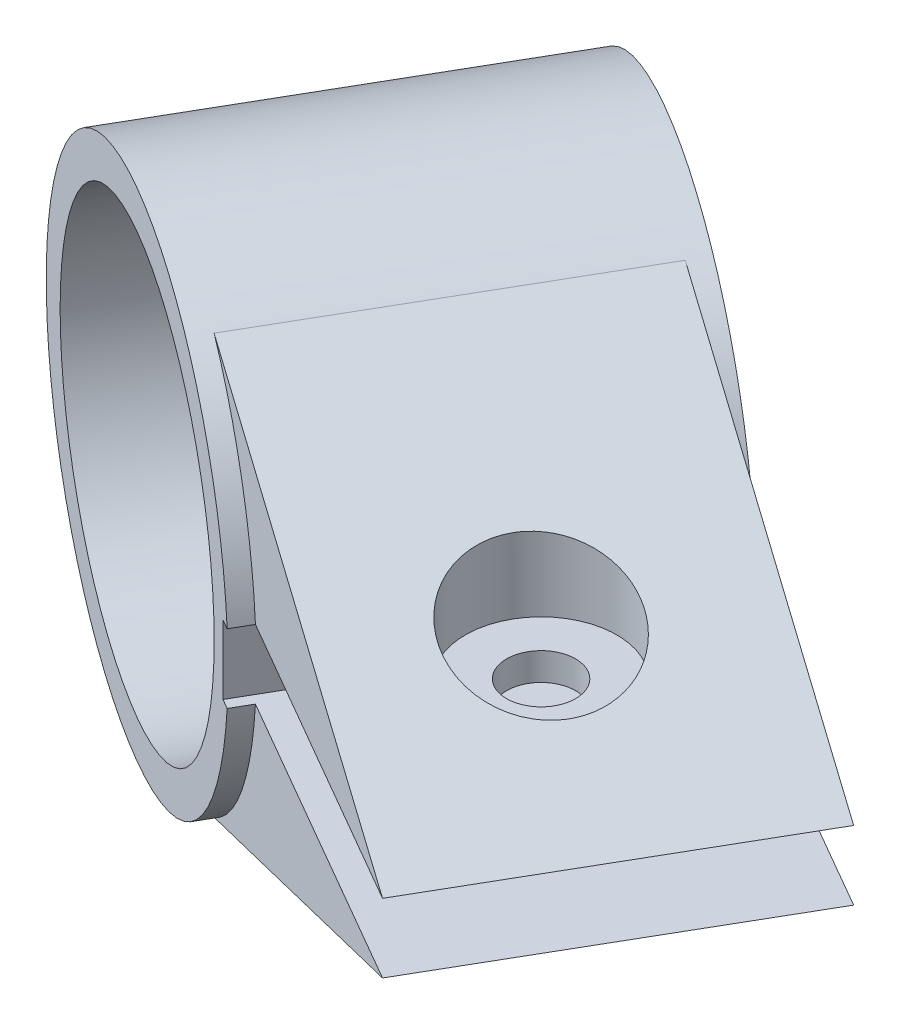
ISO-10303-21;
HEADER;
FILE_DESCRIPTION(('STEP AP214'),'2;1');
FILE_NAME('part.step','',(''),(''),'','','');
FILE_SCHEMA(('AUTOMOTIVE_DESIGN { 1 0 10303 214 1 1 1 1 }'));
ENDSEC;
DATA;
#1=APPLICATION_CONTEXT('core data for automotive mechanical design processes');
#2=APPLICATION_PROTOCOL_DEFINITION('international standard','automotive_design',2000,#1);
#3=PRODUCT_CONTEXT('',#1,'mechanical');
#4=PRODUCT('Part','Part','',(#3));
#5=PRODUCT_RELATED_PRODUCT_CATEGORY('part','',(#4));
#6=PRODUCT_DEFINITION_FORMATION('','',#4);
#7=PRODUCT_DEFINITION_CONTEXT('part definition',#1,'design');
#8=PRODUCT_DEFINITION('design','',#6,#7);
#9=PRODUCT_DEFINITION_SHAPE('','',#8);
#10=(LENGTH_UNIT() NAMED_UNIT(*) SI_UNIT(.MILLI.,.METRE.));
#11=(NAMED_UNIT(*) PLANE_ANGLE_UNIT() SI_UNIT($,.RADIAN.));
#12=(NAMED_UNIT(*) SI_UNIT($,.STERADIAN.) SOLID_ANGLE_UNIT());
#13=UNCERTAINTY_MEASURE_WITH_UNIT(LENGTH_MEASURE(1.E-05),#10,'distance_accuracy_value','');
#14=(GEOMETRIC_REPRESENTATION_CONTEXT(3) GLOBAL_UNCERTAINTY_ASSIGNED_CONTEXT((#13)) GLOBAL_UNIT_ASSIGNED_CONTEXT((#10,
#11,#12)) REPRESENTATION_CONTEXT('',''));
#15=CARTESIAN_POINT('',(0.,0.,0.));
#16=DIRECTION('',(0.,0.,1.));
#17=DIRECTION('',(1.,0.,0.));
#18=AXIS2_PLACEMENT_3D('',#15,#16,#17);
#19=CARTESIAN_POINT('',(-32.9089653438091,5.,-46.9999999999997));
#20=DIRECTION('',(-0.866025403784443,0.,-0.499999999999993));
#21=DIRECTION('',(-0.499999999999993,0.,0.866025403784443));
#22=AXIS2_PLACEMENT_3D('',#19,#20,#21);
#23=PLANE('',#22);
#24=DIRECTION('',(0.,1.,0.));
#25=VECTOR('',#24,1.);
#26=CARTESIAN_POINT('',(-38.0333209967911,2.4999999999999,-38.1243556529818));
#27=LINE('',#26,#25);
#28=CARTESIAN_POINT('',(-38.0333209967911,0.,-38.1243556529818));
#29=VERTEX_POINT('',#28);
#30=CARTESIAN_POINT('',(-38.0333209967911,5.,-38.1243556529818));
#31=VERTEX_POINT('',#30);
#32=EDGE_CURVE('E49',#29,#31,#27,.T.);
#33=ORIENTED_EDGE('',*,*,#32,.T.);
#34=DIRECTION('',(-0.499999999999993,0.,0.866025403784443));
#35=VECTOR('',#34,1.);
#36=CARTESIAN_POINT('',(-28.5788383248869,5.,-54.4999999999998));
#37=LINE('',#36,#35);
#38=CARTESIAN_POINT('',(-52.0333209967909,5.,-13.8756443470174));
#39=VERTEX_POINT('',#38);
#40=EDGE_CURVE('E151',#31,#39,#37,.T.);
#41=ORIENTED_EDGE('',*,*,#40,.T.);
#42=DIRECTION('',(0.,1.,0.));
#43=VECTOR('',#42,1.);
#44=CARTESIAN_POINT('',(-52.0333209967909,2.49999999999974,-13.8756443470174));
#45=LINE('',#44,#43);
#46=CARTESIAN_POINT('',(-52.0333209967909,0.,-13.8756443470174));
#47=VERTEX_POINT('',#46);
#48=EDGE_CURVE('E212',#47,#39,#45,.T.);
#49=ORIENTED_EDGE('',*,*,#48,.F.);
#50=DIRECTION('',(0.499999999999993,0.,-0.866025403784443));
#51=VECTOR('',#50,1.);
#52=CARTESIAN_POINT('',(-32.9089653438091,0.,-46.9999999999997));
#53=LINE('',#52,#51);
#54=EDGE_CURVE('E139',#47,#29,#53,.T.);
#55=ORIENTED_EDGE('',*,*,#54,.T.);
#56=EDGE_LOOP('',(#33,#41,#49,#55));
#57=FACE_BOUND('',#56,.T.);
#58=ADVANCED_FACE('F45',(#57),#23,.F.);
#59=CARTESIAN_POINT('',(-52.7557528611267,2.4999999999999,-46.6243556529817));
#60=DIRECTION('',(0.499999999999993,0.,-0.866025403784443));
#61=DIRECTION('',(-0.866025403784443,0.,-0.499999999999993));
#62=AXIS2_PLACEMENT_3D('',#59,#60,#61);
#63=PLANE('',#62);
#64=ORIENTED_EDGE('',*,*,#32,.F.);
#65=DIRECTION('',(-0.866025403784443,0.,-0.499999999999993));
#66=VECTOR('',#65,1.);
#67=CARTESIAN_POINT('',(-52.7557528611267,0.,-46.6243556529817));
#68=LINE('',#67,#66);
#69=CARTESIAN_POINT('',(-37.3183793798636,0.,-37.7115839179939));
#70=VERTEX_POINT('',#69);
#71=EDGE_CURVE('E181',#70,#29,#68,.T.);
#72=ORIENTED_EDGE('',*,*,#71,.F.);
#73=CARTESIAN_POINT('',(-52.7557528611267,2.4999999999999,-46.6243556529817));
#74=DIRECTION('',(0.499999999999993,0.,-0.866025403784443));
#75=DIRECTION('',(-0.866025403784443,0.,-0.499999999999993));
#76=AXIS2_PLACEMENT_3D('',#73,#74,#75);
#77=CIRCLE('',#76,18.);
#78=CARTESIAN_POINT('',(-37.3183793798637,5.,-37.7115839179939));
#79=VERTEX_POINT('',#78);
#80=EDGE_CURVE('E215',#70,#79,#77,.T.);
#81=ORIENTED_EDGE('',*,*,#80,.T.);
#82=DIRECTION('',(-0.866025403784443,0.,-0.499999999999993));
#83=VECTOR('',#82,1.);
#84=CARTESIAN_POINT('',(6.99999999999989,5.,-12.1243556529822));
#85=LINE('',#84,#83);
#86=EDGE_CURVE('E144',#79,#31,#85,.T.);
#87=ORIENTED_EDGE('',*,*,#86,.T.);
#88=EDGE_LOOP('',(#64,#72,#81,#87));
#89=FACE_BOUND('',#88,.T.);
#90=CARTESIAN_POINT('',(-52.7557528611267,2.4999999999999,-46.6243556529817));
#91=DIRECTION('',(0.499999999999993,0.,-0.866025403784443));
#92=DIRECTION('',(-0.866025403784443,0.,-0.499999999999993));
#93=AXIS2_PLACEMENT_3D('',#90,#91,#92);
#94=CIRCLE('',#93,15.25);
#95=CARTESIAN_POINT('',(-65.9626402688394,2.49999999999996,-54.2493556529816));
#96=VERTEX_POINT('',#95);
#97=EDGE_CURVE('E221',#96,#96,#94,.T.);
#98=ORIENTED_EDGE('',*,*,#97,.F.);
#99=EDGE_LOOP('',(#98));
#100=FACE_BOUND('',#99,.T.);
#101=ADVANCED_FACE('F227',(#89,#100),#63,.T.);
#102=CARTESIAN_POINT('',(-66.7557528611265,2.49999999999974,-22.3756443470173));
#103=DIRECTION('',(0.499999999999993,0.,-0.866025403784443));
#104=DIRECTION('',(-0.866025403784443,0.,-0.499999999999993));
#105=AXIS2_PLACEMENT_3D('',#102,#103,#104);
#106=PLANE('',#105);
#107=DIRECTION('',(-0.866025403784443,0.,-0.499999999999993));
#108=VECTOR('',#107,1.);
#109=CARTESIAN_POINT('',(-66.7557528611265,0.,-22.3756443470173));
#110=LINE('',#109,#108);
#111=CARTESIAN_POINT('',(-51.3183793798634,-1.61762964134837E-13,-13.4628726120295));
#112=VERTEX_POINT('',#111);
#113=EDGE_CURVE('E200',#112,#47,#110,.T.);
#114=ORIENTED_EDGE('',*,*,#113,.T.);
#115=ORIENTED_EDGE('',*,*,#48,.T.);
#116=DIRECTION('',(-0.866025403784443,0.,-0.499999999999993));
#117=VECTOR('',#116,1.);
#118=CARTESIAN_POINT('',(-6.99999999999991,5.,12.1243556529822));
#119=LINE('',#118,#117);
#120=CARTESIAN_POINT('',(-51.3183793798635,4.99999999999984,-13.4628726120295));
#121=VERTEX_POINT('',#120);
#122=EDGE_CURVE('E62',#121,#39,#119,.T.);
#123=ORIENTED_EDGE('',*,*,#122,.F.);
#124=CARTESIAN_POINT('',(-66.7557528611265,2.49999999999974,-22.3756443470173));
#125=DIRECTION('',(0.499999999999993,0.,-0.866025403784443));
#126=DIRECTION('',(-0.866025403784443,0.,-0.499999999999993));
#127=AXIS2_PLACEMENT_3D('',#124,#125,#126);
#128=CIRCLE('',#127,18.);
#129=EDGE_CURVE('E224',#112,#121,#128,.T.);
#130=ORIENTED_EDGE('',*,*,#129,.F.);
#131=EDGE_LOOP('',(#114,#115,#123,#130));
#132=FACE_BOUND('',#131,.T.);
#133=CARTESIAN_POINT('',(-66.7557528611265,2.49999999999974,-22.3756443470173));
#134=DIRECTION('',(0.499999999999993,0.,-0.866025403784443));
#135=DIRECTION('',(-0.866025403784443,0.,-0.499999999999993));
#136=AXIS2_PLACEMENT_3D('',#133,#134,#135);
#137=CIRCLE('',#136,15.25);
#138=CARTESIAN_POINT('',(-79.9626402688392,2.49999999999979,-30.0006443470172));
#139=VERTEX_POINT('',#138);
#140=EDGE_CURVE('E132',#139,#139,#137,.T.);
#141=ORIENTED_EDGE('',*,*,#140,.T.);
#142=EDGE_LOOP('',(#141));
#143=FACE_BOUND('',#142,.T.);
#144=ADVANCED_FACE('F250',(#132,#143),#106,.F.);
#145=CARTESIAN_POINT('',(-52.7557528611267,2.4999999999999,-46.6243556529817));
#146=DIRECTION('',(-0.499999999999993,0.,0.866025403784443));
#147=DIRECTION('',(0.866025403784443,0.,0.499999999999993));
#148=AXIS2_PLACEMENT_3D('',#145,#146,#147);
#149=CYLINDRICAL_SURFACE('',#148,15.25);
#150=ORIENTED_EDGE('',*,*,#97,.T.);
#151=EDGE_LOOP('',(#150));
#152=FACE_BOUND('',#151,.T.);
#153=ORIENTED_EDGE('',*,*,#140,.F.);
#154=EDGE_LOOP('',(#153));
#155=FACE_BOUND('',#154,.T.);
#156=ADVANCED_FACE('F260',(#152,#155),#149,.F.);
#157=CARTESIAN_POINT('',(-51.4023611816306,17.6974053684145,-29.6771670651969));
#158=DIRECTION('',(0.308110113816307,0.934571672132285,0.177887457151892));
#159=DIRECTION('',(0.80936280972386,-0.355774914303783,0.467285836066144));
#160=AXIS2_PLACEMENT_3D('',#157,#158,#159);
#161=PLANE('',#160);
#162=DIRECTION('',(0.80936280972386,-0.355774914303783,0.467285836066144));
#163=VECTOR('',#162,1.);
#164=CARTESIAN_POINT('',(-57.6523611816307,17.6974053684145,-18.8518495178914));
#165=LINE('',#164,#163);
#166=CARTESIAN_POINT('',(-57.6523611816314,17.6974053684148,-18.8518495178918));
#167=VERTEX_POINT('',#166);
#168=CARTESIAN_POINT('',(-28.7666604983955,5.00000000000002,-2.17468245269459));
#169=VERTEX_POINT('',#168);
#170=EDGE_CURVE('E11',#167,#169,#165,.T.);
#171=ORIENTED_EDGE('',*,*,#170,.T.);
#172=DIRECTION('',(0.500000000000001,0.,-0.866025403784438));
#173=VECTOR('',#172,1.);
#174=CARTESIAN_POINT('',(-22.5166604983953,5.,-13.));
#175=LINE('',#174,#173);
#176=CARTESIAN_POINT('',(-16.2666604983953,5.,-23.8253175473055));
#177=VERTEX_POINT('',#176);
#178=EDGE_CURVE('E140',#169,#177,#175,.T.);
#179=ORIENTED_EDGE('',*,*,#178,.T.);
#180=DIRECTION('',(0.80936280972386,-0.355774914303783,0.467285836066144));
#181=VECTOR('',#180,1.);
#182=CARTESIAN_POINT('',(-45.1523611816306,17.6974053684145,-40.5024846125024));
#183=LINE('',#182,#181);
#184=CARTESIAN_POINT('',(-45.1523611816313,17.6974053684148,-40.5024846125028));
#185=VERTEX_POINT('',#184);
#186=EDGE_CURVE('E54',#185,#177,#183,.T.);
#187=ORIENTED_EDGE('',*,*,#186,.F.);
#188=DIRECTION('',(-0.499999999999993,0.,0.866025403784443));
#189=VECTOR('',#188,1.);
#190=CARTESIAN_POINT('',(-44.4023611816316,17.6974053684148,-41.8015227181789));
#191=LINE('',#190,#189);
#192=EDGE_CURVE('E129',#167,#185,#191,.F.);
#193=ORIENTED_EDGE('',*,*,#192,.F.);
#194=EDGE_LOOP('',(#171,#179,#187,#193));
#195=FACE_BOUND('',#194,.T.);
#196=CARTESIAN_POINT('',(-34.805904521194,10.3280101079492,-19.7063016147581));
#197=DIRECTION('',(0.308110113816307,0.934571672132285,0.177887457151892));
#198=DIRECTION('',(-0.80936280972386,0.355774914303783,-0.467285836066144));
#199=AXIS2_PLACEMENT_3D('',#196,#197,#198);
#200=ELLIPSE('',#199,5.88504890957308,5.5);
#201=CARTESIAN_POINT('',(-39.5690442420084,12.4217628794261,-22.4563016147581));
#202=VERTEX_POINT('',#201);
#203=EDGE_CURVE('E160',#202,#202,#200,.T.);
#204=ORIENTED_EDGE('',*,*,#203,.F.);
#205=EDGE_LOOP('',(#204));
#206=FACE_BOUND('',#205,.T.);
#207=ADVANCED_FACE('F257',(#195,#206),#161,.T.);
#208=CARTESIAN_POINT('',(-52.7557528611267,2.4999999999999,-46.6243556529817));
#209=DIRECTION('',(-0.499999999999993,0.,0.866025403784443));
#210=DIRECTION('',(0.866025403784443,0.,0.499999999999993));
#211=AXIS2_PLACEMENT_3D('',#208,#209,#210);
#212=CYLINDRICAL_SURFACE('',#211,18.);
#213=ORIENTED_EDGE('',*,*,#80,.F.);
#214=DIRECTION('',(-0.499999999999993,0.,0.866025403784443));
#215=VECTOR('',#214,1.);
#216=CARTESIAN_POINT('',(-37.3183793798636,0.,-37.7115839179939));
#217=LINE('',#216,#215);
#218=CARTESIAN_POINT('',(-38.0683793798634,0.,-36.4125458123176));
#219=VERTEX_POINT('',#218);
#220=EDGE_CURVE('E185',#70,#219,#217,.T.);
#221=ORIENTED_EDGE('',*,*,#220,.T.);
#222=CARTESIAN_POINT('',(-53.5057528611263,2.4999999999999,-45.3253175473056));
#223=DIRECTION('',(0.500000000000001,0.,-0.866025403784438));
#224=DIRECTION('',(-0.866025403784438,0.,-0.500000000000001));
#225=AXIS2_PLACEMENT_3D('',#222,#223,#224);
#226=CIRCLE('',#225,18.);
#227=CARTESIAN_POINT('',(-45.1523611816307,-12.6974053684145,-40.5024846125024));
#228=VERTEX_POINT('',#227);
#229=EDGE_CURVE('E199',#219,#228,#226,.T.);
#230=ORIENTED_EDGE('',*,*,#229,.T.);
#231=DIRECTION('',(-0.499999999999993,0.,0.866025403784443));
#232=VECTOR('',#231,1.);
#233=CARTESIAN_POINT('',(-44.402361181631,-12.6974053684145,-41.8015227181785));
#234=LINE('',#233,#232);
#235=CARTESIAN_POINT('',(-57.6523611816297,-12.697405368414,-18.8518495178909));
#236=VERTEX_POINT('',#235);
#237=EDGE_CURVE('E196',#228,#236,#234,.T.);
#238=ORIENTED_EDGE('',*,*,#237,.T.);
#239=CARTESIAN_POINT('',(-66.0057528611262,2.49999999999975,-23.6746824526945));
#240=DIRECTION('',(0.500000000000001,0.,-0.866025403784438));
#241=DIRECTION('',(-0.866025403784438,0.,-0.500000000000001));
#242=AXIS2_PLACEMENT_3D('',#239,#240,#241);
#243=CIRCLE('',#242,18.);
#244=CARTESIAN_POINT('',(-50.5683793798632,-1.53089346754953E-13,-14.7619107177066));
#245=VERTEX_POINT('',#244);
#246=EDGE_CURVE('E205',#245,#236,#243,.T.);
#247=ORIENTED_EDGE('',*,*,#246,.F.);
#248=EDGE_CURVE('E184',#245,#112,#217,.T.);
#249=ORIENTED_EDGE('',*,*,#248,.T.);
#250=ORIENTED_EDGE('',*,*,#129,.T.);
#251=DIRECTION('',(-0.499999999999993,0.,0.866025403784443));
#252=VECTOR('',#251,1.);
#253=CARTESIAN_POINT('',(-37.3183793798637,5.,-37.7115839179939));
#254=LINE('',#253,#252);
#255=CARTESIAN_POINT('',(-50.5683793798632,4.99999999999985,-14.7619107177066));
#256=VERTEX_POINT('',#255);
#257=EDGE_CURVE('E147',#256,#121,#254,.T.);
#258=ORIENTED_EDGE('',*,*,#257,.F.);
#259=CARTESIAN_POINT('',(-66.0057528611262,2.49999999999975,-23.6746824526945));
#260=DIRECTION('',(0.500000000000001,0.,-0.866025403784438));
#261=DIRECTION('',(-0.866025403784438,0.,-0.500000000000001));
#262=AXIS2_PLACEMENT_3D('',#259,#260,#261);
#263=CIRCLE('',#262,18.);
#264=EDGE_CURVE('E70',#167,#256,#263,.T.);
#265=ORIENTED_EDGE('',*,*,#264,.F.);
#266=ORIENTED_EDGE('',*,*,#192,.T.);
#267=CARTESIAN_POINT('',(-53.5057528611263,2.4999999999999,-45.3253175473056));
#268=DIRECTION('',(0.500000000000001,0.,-0.866025403784438));
#269=DIRECTION('',(-0.866025403784438,0.,-0.500000000000001));
#270=AXIS2_PLACEMENT_3D('',#267,#268,#269);
#271=CIRCLE('',#270,18.);
#272=CARTESIAN_POINT('',(-38.0683793798634,4.99999999999999,-36.4125458123177));
#273=VERTEX_POINT('',#272);
#274=EDGE_CURVE('E124',#185,#273,#271,.T.);
#275=ORIENTED_EDGE('',*,*,#274,.T.);
#276=EDGE_CURVE('E127',#79,#273,#254,.T.);
#277=ORIENTED_EDGE('',*,*,#276,.F.);
#278=EDGE_LOOP('',(#213,#221,#230,#238,#247,#249,#250,#258,#265,#266,#275,#277));
#279=FACE_BOUND('',#278,.T.);
#280=ADVANCED_FACE('F47',(#279),#212,.T.);
#281=CARTESIAN_POINT('',(0.543026266155381,2.49999999999987,14.7472730906825));
#282=DIRECTION('',(0.500000000000001,0.,-0.866025403784438));
#283=DIRECTION('',(-0.866025403784438,0.,-0.500000000000001));
#284=AXIS2_PLACEMENT_3D('',#281,#282,#283);
#285=PLANE('',#284);
#286=ORIENTED_EDGE('',*,*,#264,.T.);
#287=DIRECTION('',(-0.866025403784438,0.,-0.500000000000001));
#288=VECTOR('',#287,1.);
#289=CARTESIAN_POINT('',(-6.25000000000001,5.,10.8253175473055));
#290=LINE('',#289,#288);
#291=EDGE_CURVE('E145',#169,#256,#290,.T.);
#292=ORIENTED_EDGE('',*,*,#291,.F.);
#293=ORIENTED_EDGE('',*,*,#170,.F.);
#294=EDGE_LOOP('',(#286,#292,#293));
#295=FACE_BOUND('',#294,.T.);
#296=ADVANCED_FACE('F255',(#295),#285,.F.);
#297=CARTESIAN_POINT('',(13.0430262661554,2.49999999999987,-6.90336200392846));
#298=DIRECTION('',(0.500000000000001,0.,-0.866025403784438));
#299=DIRECTION('',(-0.866025403784438,0.,-0.500000000000001));
#300=AXIS2_PLACEMENT_3D('',#297,#298,#299);
#301=PLANE('',#300);
#302=ORIENTED_EDGE('',*,*,#186,.T.);
#303=DIRECTION('',(-0.866025403784438,0.,-0.500000000000001));
#304=VECTOR('',#303,1.);
#305=CARTESIAN_POINT('',(6.25000000000002,5.,-10.8253175473055));
#306=LINE('',#305,#304);
#307=EDGE_CURVE('E135',#177,#273,#306,.T.);
#308=ORIENTED_EDGE('',*,*,#307,.T.);
#309=ORIENTED_EDGE('',*,*,#274,.F.);
#310=EDGE_LOOP('',(#302,#308,#309));
#311=FACE_BOUND('',#310,.T.);
#312=ADVANCED_FACE('F136',(#311),#301,.T.);
#313=CARTESIAN_POINT('',(-32.9089653438091,0.,-46.9999999999997));
#314=DIRECTION('',(0.,-1.,0.));
#315=DIRECTION('',(0.,0.,-1.));
#316=AXIS2_PLACEMENT_3D('',#313,#314,#315);
#317=PLANE('',#316);
#318=CARTESIAN_POINT('',(-34.805904521194,0.,-19.7063016147581));
#319=DIRECTION('',(0.,-1.,0.));
#320=DIRECTION('',(0.,0.,-1.));
#321=AXIS2_PLACEMENT_3D('',#318,#319,#320);
#322=CIRCLE('',#321,2.5);
#323=CARTESIAN_POINT('',(-34.805904521194,0.,-22.2063016147581));
#324=VERTEX_POINT('',#323);
#325=EDGE_CURVE('E188',#324,#324,#322,.F.);
#326=ORIENTED_EDGE('',*,*,#325,.F.);
#327=EDGE_LOOP('',(#326));
#328=FACE_BOUND('',#327,.T.);
#329=ORIENTED_EDGE('',*,*,#54,.F.);
#330=ORIENTED_EDGE('',*,*,#113,.F.);
#331=ORIENTED_EDGE('',*,*,#248,.F.);
#332=DIRECTION('',(-0.866025403784438,0.,-0.500000000000001));
#333=VECTOR('',#332,1.);
#334=CARTESIAN_POINT('',(-6.25000000000001,0.,10.8253175473055));
#335=LINE('',#334,#333);
#336=CARTESIAN_POINT('',(-28.7666604983955,0.,-2.17468245269459));
#337=VERTEX_POINT('',#336);
#338=EDGE_CURVE('E175',#337,#245,#335,.T.);
#339=ORIENTED_EDGE('',*,*,#338,.F.);
#340=DIRECTION('',(-0.500000000000001,0.,0.866025403784438));
#341=VECTOR('',#340,1.);
#342=CARTESIAN_POINT('',(-22.5166604983953,0.,-13.));
#343=LINE('',#342,#341);
#344=CARTESIAN_POINT('',(-16.2666604983953,0.,-23.8253175473055));
#345=VERTEX_POINT('',#344);
#346=EDGE_CURVE('E191',#337,#345,#343,.F.);
#347=ORIENTED_EDGE('',*,*,#346,.T.);
#348=DIRECTION('',(-0.866025403784438,0.,-0.500000000000001));
#349=VECTOR('',#348,1.);
#350=CARTESIAN_POINT('',(6.25000000000002,0.,-10.8253175473055));
#351=LINE('',#350,#349);
#352=EDGE_CURVE('E170',#345,#219,#351,.T.);
#353=ORIENTED_EDGE('',*,*,#352,.T.);
#354=ORIENTED_EDGE('',*,*,#220,.F.);
#355=ORIENTED_EDGE('',*,*,#71,.T.);
#356=EDGE_LOOP('',(#329,#330,#331,#339,#347,#353,#354,#355));
#357=FACE_BOUND('',#356,.T.);
#358=ADVANCED_FACE('F234',(#328,#357),#317,.F.);
#359=CARTESIAN_POINT('',(-51.4023611816306,-12.6974053684145,-29.6771670651969));
#360=DIRECTION('',(-0.308110113816307,0.934571672132285,-0.177887457151892));
#361=DIRECTION('',(0.80936280972386,0.355774914303783,0.467285836066144));
#362=AXIS2_PLACEMENT_3D('',#359,#360,#361);
#363=PLANE('',#362);
#364=DIRECTION('',(0.80936280972386,0.355774914303783,0.467285836066144));
#365=VECTOR('',#364,1.);
#366=CARTESIAN_POINT('',(-45.1523611816306,-12.6974053684145,-40.5024846125024));
#367=LINE('',#366,#365);
#368=EDGE_CURVE('E203',#228,#345,#367,.T.);
#369=ORIENTED_EDGE('',*,*,#368,.T.);
#370=ORIENTED_EDGE('',*,*,#346,.F.);
#371=DIRECTION('',(0.80936280972386,0.355774914303783,0.467285836066144));
#372=VECTOR('',#371,1.);
#373=CARTESIAN_POINT('',(-57.6523611816307,-12.6974053684145,-18.8518495178914));
#374=LINE('',#373,#372);
#375=EDGE_CURVE('E201',#236,#337,#374,.T.);
#376=ORIENTED_EDGE('',*,*,#375,.F.);
#377=ORIENTED_EDGE('',*,*,#237,.F.);
#378=EDGE_LOOP('',(#369,#370,#376,#377));
#379=FACE_BOUND('',#378,.T.);
#380=CARTESIAN_POINT('',(-34.805904521194,-5.3280101079492,-19.7063016147581));
#381=DIRECTION('',(-0.308110113816307,0.934571672132285,-0.177887457151892));
#382=DIRECTION('',(-0.80936280972386,-0.355774914303783,-0.467285836066144));
#383=AXIS2_PLACEMENT_3D('',#380,#381,#382);
#384=ELLIPSE('',#383,5.88504890957308,5.5);
#385=CARTESIAN_POINT('',(-39.5690442420084,-7.42176287942613,-22.4563016147581));
#386=VERTEX_POINT('',#385);
#387=EDGE_CURVE('E174',#386,#386,#384,.T.);
#388=ORIENTED_EDGE('',*,*,#387,.T.);
#389=EDGE_LOOP('',(#388));
#390=FACE_BOUND('',#389,.T.);
#391=ADVANCED_FACE('F241',(#379,#390),#363,.F.);
#392=CARTESIAN_POINT('',(0.543026266155381,2.49999999999987,14.7472730906825));
#393=DIRECTION('',(0.500000000000001,0.,-0.866025403784438));
#394=DIRECTION('',(-0.866025403784438,0.,-0.500000000000001));
#395=AXIS2_PLACEMENT_3D('',#392,#393,#394);
#396=PLANE('',#395);
#397=ORIENTED_EDGE('',*,*,#375,.T.);
#398=ORIENTED_EDGE('',*,*,#338,.T.);
#399=ORIENTED_EDGE('',*,*,#246,.T.);
#400=EDGE_LOOP('',(#397,#398,#399));
#401=FACE_BOUND('',#400,.T.);
#402=ADVANCED_FACE('F247',(#401),#396,.F.);
#403=CARTESIAN_POINT('',(13.0430262661554,2.49999999999987,-6.90336200392846));
#404=DIRECTION('',(0.500000000000001,0.,-0.866025403784438));
#405=DIRECTION('',(-0.866025403784438,0.,-0.500000000000001));
#406=AXIS2_PLACEMENT_3D('',#403,#404,#405);
#407=PLANE('',#406);
#408=ORIENTED_EDGE('',*,*,#229,.F.);
#409=ORIENTED_EDGE('',*,*,#352,.F.);
#410=ORIENTED_EDGE('',*,*,#368,.F.);
#411=EDGE_LOOP('',(#408,#409,#410));
#412=FACE_BOUND('',#411,.T.);
#413=ADVANCED_FACE('F239',(#412),#407,.T.);
#414=CARTESIAN_POINT('',(-34.805904521194,-2.,-19.7063016147581));
#415=DIRECTION('',(0.,-1.,0.));
#416=DIRECTION('',(0.,0.,1.));
#417=AXIS2_PLACEMENT_3D('',#414,#415,#416);
#418=PLANE('',#417);
#419=CARTESIAN_POINT('',(-34.805904521194,-2.,-19.7063016147581));
#420=DIRECTION('',(0.,1.,0.));
#421=DIRECTION('',(0.,0.,1.));
#422=AXIS2_PLACEMENT_3D('',#419,#420,#421);
#423=CIRCLE('',#422,5.5);
#424=CARTESIAN_POINT('',(-34.805904521194,-2.,-14.2063016147581));
#425=VERTEX_POINT('',#424);
#426=EDGE_CURVE('E178',#425,#425,#423,.T.);
#427=ORIENTED_EDGE('',*,*,#426,.F.);
#428=EDGE_LOOP('',(#427));
#429=FACE_BOUND('',#428,.T.);
#430=CARTESIAN_POINT('',(-34.805904521194,-2.,-19.7063016147581));
#431=DIRECTION('',(0.,-1.,0.));
#432=DIRECTION('',(0.,0.,-1.));
#433=AXIS2_PLACEMENT_3D('',#430,#431,#432);
#434=CIRCLE('',#433,2.5);
#435=CARTESIAN_POINT('',(-34.805904521194,-2.,-22.2063016147581));
#436=VERTEX_POINT('',#435);
#437=EDGE_CURVE('E171',#436,#436,#434,.F.);
#438=ORIENTED_EDGE('',*,*,#437,.T.);
#439=EDGE_LOOP('',(#438));
#440=FACE_BOUND('',#439,.T.);
#441=ADVANCED_FACE('F307',(#429,#440),#418,.T.);
#442=CARTESIAN_POINT('',(-34.805904521194,-12.5,-19.7063016147581));
#443=DIRECTION('',(0.,1.,0.));
#444=DIRECTION('',(0.,0.,1.));
#445=AXIS2_PLACEMENT_3D('',#442,#443,#444);
#446=CYLINDRICAL_SURFACE('',#445,2.5);
#447=ORIENTED_EDGE('',*,*,#325,.T.);
#448=EDGE_LOOP('',(#447));
#449=FACE_BOUND('',#448,.T.);
#450=ORIENTED_EDGE('',*,*,#437,.F.);
#451=EDGE_LOOP('',(#450));
#452=FACE_BOUND('',#451,.T.);
#453=ADVANCED_FACE('F313',(#449,#452),#446,.F.);
#454=CARTESIAN_POINT('',(-34.805904521194,-2.,-19.7063016147581));
#455=DIRECTION('',(0.,-1.,0.));
#456=DIRECTION('',(0.,0.,-1.));
#457=AXIS2_PLACEMENT_3D('',#454,#455,#456);
#458=CYLINDRICAL_SURFACE('',#457,5.5);
#459=ORIENTED_EDGE('',*,*,#387,.F.);
#460=EDGE_LOOP('',(#459));
#461=FACE_BOUND('',#460,.T.);
#462=ORIENTED_EDGE('',*,*,#426,.T.);
#463=EDGE_LOOP('',(#462));
#464=FACE_BOUND('',#463,.T.);
#465=ADVANCED_FACE('F312',(#461,#464),#458,.F.);
#466=CARTESIAN_POINT('',(-24.2487113059647,5.,-51.9999999999998));
#467=DIRECTION('',(0.,1.,0.));
#468=DIRECTION('',(0.,0.,1.));
#469=AXIS2_PLACEMENT_3D('',#466,#467,#468);
#470=PLANE('',#469);
#471=ORIENTED_EDGE('',*,*,#40,.F.);
#472=ORIENTED_EDGE('',*,*,#86,.F.);
#473=ORIENTED_EDGE('',*,*,#276,.T.);
#474=ORIENTED_EDGE('',*,*,#307,.F.);
#475=ORIENTED_EDGE('',*,*,#178,.F.);
#476=ORIENTED_EDGE('',*,*,#291,.T.);
#477=ORIENTED_EDGE('',*,*,#257,.T.);
#478=ORIENTED_EDGE('',*,*,#122,.T.);
#479=EDGE_LOOP('',(#471,#472,#473,#474,#475,#476,#477,#478));
#480=FACE_BOUND('',#479,.T.);
#481=CARTESIAN_POINT('',(-34.805904521194,5.,-19.7063016147581));
#482=DIRECTION('',(0.,1.,0.));
#483=DIRECTION('',(0.,0.,1.));
#484=AXIS2_PLACEMENT_3D('',#481,#482,#483);
#485=CIRCLE('',#484,2.5);
#486=CARTESIAN_POINT('',(-34.805904521194,5.,-17.2063016147581));
#487=VERTEX_POINT('',#486);
#488=EDGE_CURVE('E155',#487,#487,#485,.F.);
#489=ORIENTED_EDGE('',*,*,#488,.F.);
#490=EDGE_LOOP('',(#489));
#491=FACE_BOUND('',#490,.T.);
#492=ADVANCED_FACE('F142',(#480,#491),#470,.F.);
#493=CARTESIAN_POINT('',(-34.805904521194,7.,-19.7063016147581));
#494=DIRECTION('',(0.,1.,0.));
#495=DIRECTION('',(0.,0.,1.));
#496=AXIS2_PLACEMENT_3D('',#493,#494,#495);
#497=PLANE('',#496);
#498=CARTESIAN_POINT('',(-34.805904521194,7.,-19.7063016147581));
#499=DIRECTION('',(0.,1.,0.));
#500=DIRECTION('',(0.,0.,1.));
#501=AXIS2_PLACEMENT_3D('',#498,#499,#500);
#502=CIRCLE('',#501,5.5);
#503=CARTESIAN_POINT('',(-34.805904521194,7.,-14.2063016147581));
#504=VERTEX_POINT('',#503);
#505=EDGE_CURVE('E152',#504,#504,#502,.T.);
#506=ORIENTED_EDGE('',*,*,#505,.T.);
#507=EDGE_LOOP('',(#506));
#508=FACE_BOUND('',#507,.T.);
#509=CARTESIAN_POINT('',(-34.805904521194,7.,-19.7063016147581));
#510=DIRECTION('',(0.,1.,0.));
#511=DIRECTION('',(0.,0.,1.));
#512=AXIS2_PLACEMENT_3D('',#509,#510,#511);
#513=CIRCLE('',#512,2.5);
#514=CARTESIAN_POINT('',(-34.805904521194,7.,-17.2063016147581));
#515=VERTEX_POINT('',#514);
#516=EDGE_CURVE('E158',#515,#515,#513,.F.);
#517=ORIENTED_EDGE('',*,*,#516,.T.);
#518=EDGE_LOOP('',(#517));
#519=FACE_BOUND('',#518,.T.);
#520=ADVANCED_FACE('F271',(#508,#519),#497,.T.);
#521=CARTESIAN_POINT('',(-34.805904521194,-12.5,-19.7063016147581));
#522=DIRECTION('',(0.,1.,0.));
#523=DIRECTION('',(0.,0.,1.));
#524=AXIS2_PLACEMENT_3D('',#521,#522,#523);
#525=CYLINDRICAL_SURFACE('',#524,2.5);
#526=ORIENTED_EDGE('',*,*,#488,.T.);
#527=EDGE_LOOP('',(#526));
#528=FACE_BOUND('',#527,.T.);
#529=ORIENTED_EDGE('',*,*,#516,.F.);
#530=EDGE_LOOP('',(#529));
#531=FACE_BOUND('',#530,.T.);
#532=ADVANCED_FACE('F267',(#528,#531),#525,.F.);
#533=CARTESIAN_POINT('',(-34.805904521194,7.,-19.7063016147581));
#534=DIRECTION('',(0.,1.,0.));
#535=DIRECTION('',(0.,0.,1.));
#536=AXIS2_PLACEMENT_3D('',#533,#534,#535);
#537=CYLINDRICAL_SURFACE('',#536,5.5);
#538=ORIENTED_EDGE('',*,*,#203,.T.);
#539=EDGE_LOOP('',(#538));
#540=FACE_BOUND('',#539,.T.);
#541=ORIENTED_EDGE('',*,*,#505,.F.);
#542=EDGE_LOOP('',(#541));
#543=FACE_BOUND('',#542,.T.);
#544=ADVANCED_FACE('F264',(#540,#543),#537,.F.);
#545=CLOSED_SHELL('',(#58,#101,#144,#156,#207,#280,#296,#312,#358,#391,#402,#413,#441,#453,#465,
#492,#520,#532,#544));
#546=MANIFOLD_SOLID_BREP('B2',#545);
#547=ADVANCED_BREP_SHAPE_REPRESENTATION('',(#18,#546),#14);
#548=SHAPE_DEFINITION_REPRESENTATION(#9,#547);
ENDSEC;
END-ISO-10303-21;
